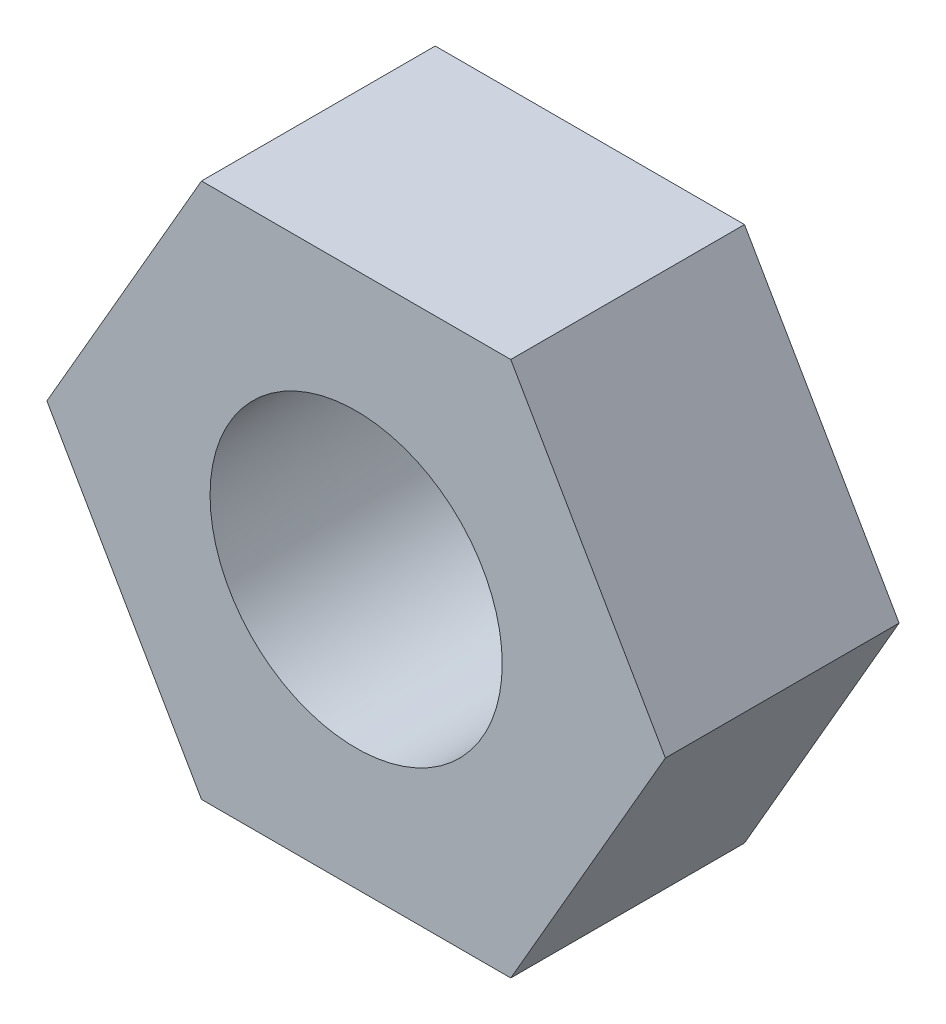
ISO-10303-21;
HEADER;
FILE_DESCRIPTION(('STEP AP214'),'2;1');
FILE_NAME('part.step','',(''),(''),'','','');
FILE_SCHEMA(('AUTOMOTIVE_DESIGN { 1 0 10303 214 1 1 1 1 }'));
ENDSEC;
DATA;
#1=APPLICATION_CONTEXT('core data for automotive mechanical design processes');
#2=APPLICATION_PROTOCOL_DEFINITION('international standard','automotive_design',2000,#1);
#3=PRODUCT_CONTEXT('',#1,'mechanical');
#4=PRODUCT('Part','Part','',(#3));
#5=PRODUCT_RELATED_PRODUCT_CATEGORY('part','',(#4));
#6=PRODUCT_DEFINITION_FORMATION('','',#4);
#7=PRODUCT_DEFINITION_CONTEXT('part definition',#1,'design');
#8=PRODUCT_DEFINITION('design','',#6,#7);
#9=PRODUCT_DEFINITION_SHAPE('','',#8);
#10=(LENGTH_UNIT() NAMED_UNIT(*) SI_UNIT(.MILLI.,.METRE.));
#11=(NAMED_UNIT(*) PLANE_ANGLE_UNIT() SI_UNIT($,.RADIAN.));
#12=(NAMED_UNIT(*) SI_UNIT($,.STERADIAN.) SOLID_ANGLE_UNIT());
#13=UNCERTAINTY_MEASURE_WITH_UNIT(LENGTH_MEASURE(1.E-05),#10,'distance_accuracy_value','');
#14=(GEOMETRIC_REPRESENTATION_CONTEXT(3) GLOBAL_UNCERTAINTY_ASSIGNED_CONTEXT((#13)) GLOBAL_UNIT_ASSIGNED_CONTEXT((#10,
#11,#12)) REPRESENTATION_CONTEXT('',''));
#15=CARTESIAN_POINT('',(0.,0.,0.));
#16=DIRECTION('',(0.,0.,1.));
#17=DIRECTION('',(1.,0.,0.));
#18=AXIS2_PLACEMENT_3D('',#15,#16,#17);
#19=CARTESIAN_POINT('',(0.,0.,2.4));
#20=DIRECTION('',(0.,0.,1.));
#21=DIRECTION('',(1.,0.,0.));
#22=AXIS2_PLACEMENT_3D('',#19,#20,#21);
#23=PLANE('',#22);
#24=DIRECTION('',(-1.,0.,0.));
#25=VECTOR('',#24,1.);
#26=CARTESIAN_POINT('',(1.58771324027148,2.75000000000002,2.4));
#27=LINE('',#26,#25);
#28=CARTESIAN_POINT('',(1.58771324027148,2.75000000000002,2.4));
#29=VERTEX_POINT('',#28);
#30=CARTESIAN_POINT('',(-1.58771324027148,2.75000000000002,2.4));
#31=VERTEX_POINT('',#30);
#32=EDGE_CURVE('E135',#29,#31,#27,.T.);
#33=ORIENTED_EDGE('',*,*,#32,.T.);
#34=DIRECTION('',(-0.5,-0.866025403784439,0.));
#35=VECTOR('',#34,1.);
#36=CARTESIAN_POINT('',(-1.58771324027148,2.75000000000002,2.4));
#37=LINE('',#36,#35);
#38=CARTESIAN_POINT('',(-3.17542648054297,0.,2.4));
#39=VERTEX_POINT('',#38);
#40=EDGE_CURVE('E93',#31,#39,#37,.T.);
#41=ORIENTED_EDGE('',*,*,#40,.T.);
#42=DIRECTION('',(0.5,-0.866025403784439,0.));
#43=VECTOR('',#42,1.);
#44=CARTESIAN_POINT('',(-3.17542648054297,0.,2.4));
#45=LINE('',#44,#43);
#46=CARTESIAN_POINT('',(-1.58771324027148,-2.75000000000002,2.4));
#47=VERTEX_POINT('',#46);
#48=EDGE_CURVE('E106',#39,#47,#45,.T.);
#49=ORIENTED_EDGE('',*,*,#48,.T.);
#50=DIRECTION('',(1.,0.,0.));
#51=VECTOR('',#50,1.);
#52=CARTESIAN_POINT('',(-1.58771324027148,-2.75000000000002,2.4));
#53=LINE('',#52,#51);
#54=CARTESIAN_POINT('',(1.58771324027148,-2.75000000000002,2.4));
#55=VERTEX_POINT('',#54);
#56=EDGE_CURVE('E100',#47,#55,#53,.T.);
#57=ORIENTED_EDGE('',*,*,#56,.T.);
#58=DIRECTION('',(0.5,0.866025403784439,0.));
#59=VECTOR('',#58,1.);
#60=CARTESIAN_POINT('',(1.58771324027148,-2.75000000000002,2.4));
#61=LINE('',#60,#59);
#62=CARTESIAN_POINT('',(3.17542648054297,0.,2.4));
#63=VERTEX_POINT('',#62);
#64=EDGE_CURVE('E104',#55,#63,#61,.T.);
#65=ORIENTED_EDGE('',*,*,#64,.T.);
#66=DIRECTION('',(-0.5,0.866025403784439,0.));
#67=VECTOR('',#66,1.);
#68=CARTESIAN_POINT('',(3.17542648054297,0.,2.4));
#69=LINE('',#68,#67);
#70=EDGE_CURVE('E56',#63,#29,#69,.T.);
#71=ORIENTED_EDGE('',*,*,#70,.T.);
#72=EDGE_LOOP('',(#33,#41,#49,#57,#65,#71));
#73=FACE_BOUND('',#72,.T.);
#74=CARTESIAN_POINT('',(0.,0.,2.4));
#75=DIRECTION('',(0.,0.,1.));
#76=DIRECTION('',(1.,0.,0.));
#77=AXIS2_PLACEMENT_3D('',#74,#75,#76);
#78=CIRCLE('',#77,1.5);
#79=CARTESIAN_POINT('',(1.5,0.,2.4));
#80=VERTEX_POINT('',#79);
#81=EDGE_CURVE('E128',#80,#80,#78,.T.);
#82=ORIENTED_EDGE('',*,*,#81,.F.);
#83=EDGE_LOOP('',(#82));
#84=FACE_BOUND('',#83,.T.);
#85=ADVANCED_FACE('F39',(#73,#84),#23,.T.);
#86=CARTESIAN_POINT('',(0.,0.,0.));
#87=DIRECTION('',(0.,0.,1.));
#88=DIRECTION('',(1.,0.,0.));
#89=AXIS2_PLACEMENT_3D('',#86,#87,#88);
#90=PLANE('',#89);
#91=DIRECTION('',(-1.,0.,0.));
#92=VECTOR('',#91,1.);
#93=CARTESIAN_POINT('',(1.58771324027148,2.75000000000002,0.));
#94=LINE('',#93,#92);
#95=CARTESIAN_POINT('',(1.58771324027148,2.75000000000002,0.));
#96=VERTEX_POINT('',#95);
#97=CARTESIAN_POINT('',(-1.58771324027148,2.75000000000002,0.));
#98=VERTEX_POINT('',#97);
#99=EDGE_CURVE('E124',#96,#98,#94,.T.);
#100=ORIENTED_EDGE('',*,*,#99,.F.);
#101=DIRECTION('',(-0.5,0.866025403784439,0.));
#102=VECTOR('',#101,1.);
#103=CARTESIAN_POINT('',(3.17542648054297,0.,0.));
#104=LINE('',#103,#102);
#105=CARTESIAN_POINT('',(3.17542648054297,0.,0.));
#106=VERTEX_POINT('',#105);
#107=EDGE_CURVE('E85',#106,#96,#104,.T.);
#108=ORIENTED_EDGE('',*,*,#107,.F.);
#109=DIRECTION('',(0.5,0.866025403784439,0.));
#110=VECTOR('',#109,1.);
#111=CARTESIAN_POINT('',(1.58771324027148,-2.75000000000002,0.));
#112=LINE('',#111,#110);
#113=CARTESIAN_POINT('',(1.58771324027148,-2.75000000000002,0.));
#114=VERTEX_POINT('',#113);
#115=EDGE_CURVE('E79',#114,#106,#112,.T.);
#116=ORIENTED_EDGE('',*,*,#115,.F.);
#117=DIRECTION('',(1.,0.,0.));
#118=VECTOR('',#117,1.);
#119=CARTESIAN_POINT('',(-1.58771324027148,-2.75000000000002,0.));
#120=LINE('',#119,#118);
#121=CARTESIAN_POINT('',(-1.58771324027148,-2.75000000000002,0.));
#122=VERTEX_POINT('',#121);
#123=EDGE_CURVE('E114',#122,#114,#120,.T.);
#124=ORIENTED_EDGE('',*,*,#123,.F.);
#125=DIRECTION('',(0.5,-0.866025403784439,0.));
#126=VECTOR('',#125,1.);
#127=CARTESIAN_POINT('',(-3.17542648054297,0.,0.));
#128=LINE('',#127,#126);
#129=CARTESIAN_POINT('',(-3.17542648054297,0.,0.));
#130=VERTEX_POINT('',#129);
#131=EDGE_CURVE('E130',#130,#122,#128,.T.);
#132=ORIENTED_EDGE('',*,*,#131,.F.);
#133=DIRECTION('',(-0.5,-0.866025403784439,0.));
#134=VECTOR('',#133,1.);
#135=CARTESIAN_POINT('',(-1.58771324027148,2.75000000000002,0.));
#136=LINE('',#135,#134);
#137=EDGE_CURVE('E127',#98,#130,#136,.T.);
#138=ORIENTED_EDGE('',*,*,#137,.F.);
#139=EDGE_LOOP('',(#100,#108,#116,#124,#132,#138));
#140=FACE_BOUND('',#139,.T.);
#141=CARTESIAN_POINT('',(0.,0.,0.));
#142=DIRECTION('',(0.,0.,1.));
#143=DIRECTION('',(1.,0.,0.));
#144=AXIS2_PLACEMENT_3D('',#141,#142,#143);
#145=CIRCLE('',#144,1.5);
#146=CARTESIAN_POINT('',(1.5,0.,0.));
#147=VERTEX_POINT('',#146);
#148=EDGE_CURVE('E246',#147,#147,#145,.T.);
#149=ORIENTED_EDGE('',*,*,#148,.T.);
#150=EDGE_LOOP('',(#149));
#151=FACE_BOUND('',#150,.T.);
#152=ADVANCED_FACE('F144',(#140,#151),#90,.F.);
#153=CARTESIAN_POINT('',(1.58771324027148,2.75000000000002,2.4));
#154=DIRECTION('',(0.,-1.,0.));
#155=DIRECTION('',(1.,0.,0.));
#156=AXIS2_PLACEMENT_3D('',#153,#154,#155);
#157=PLANE('',#156);
#158=ORIENTED_EDGE('',*,*,#99,.T.);
#159=DIRECTION('',(0.,0.,-1.));
#160=VECTOR('',#159,1.);
#161=CARTESIAN_POINT('',(-1.58771324027148,2.75000000000002,2.4));
#162=LINE('',#161,#160);
#163=EDGE_CURVE('E11',#31,#98,#162,.T.);
#164=ORIENTED_EDGE('',*,*,#163,.F.);
#165=ORIENTED_EDGE('',*,*,#32,.F.);
#166=DIRECTION('',(0.,0.,-1.));
#167=VECTOR('',#166,1.);
#168=CARTESIAN_POINT('',(1.58771324027148,2.75000000000002,2.4));
#169=LINE('',#168,#167);
#170=EDGE_CURVE('E120',#29,#96,#169,.T.);
#171=ORIENTED_EDGE('',*,*,#170,.T.);
#172=EDGE_LOOP('',(#158,#164,#165,#171));
#173=FACE_BOUND('',#172,.T.);
#174=ADVANCED_FACE('F41',(#173),#157,.F.);
#175=CARTESIAN_POINT('',(-1.58771324027148,2.75000000000002,2.4));
#176=DIRECTION('',(0.866025403784439,-0.5,0.));
#177=DIRECTION('',(0.5,0.866025403784439,0.));
#178=AXIS2_PLACEMENT_3D('',#175,#176,#177);
#179=PLANE('',#178);
#180=ORIENTED_EDGE('',*,*,#137,.T.);
#181=DIRECTION('',(0.,0.,-1.));
#182=VECTOR('',#181,1.);
#183=CARTESIAN_POINT('',(-3.17542648054297,0.,2.4));
#184=LINE('',#183,#182);
#185=EDGE_CURVE('E48',#39,#130,#184,.T.);
#186=ORIENTED_EDGE('',*,*,#185,.F.);
#187=ORIENTED_EDGE('',*,*,#40,.F.);
#188=ORIENTED_EDGE('',*,*,#163,.T.);
#189=EDGE_LOOP('',(#180,#186,#187,#188));
#190=FACE_BOUND('',#189,.T.);
#191=ADVANCED_FACE('F169',(#190),#179,.F.);
#192=CARTESIAN_POINT('',(-3.17542648054297,0.,2.4));
#193=DIRECTION('',(0.866025403784439,0.5,0.));
#194=DIRECTION('',(-0.5,0.866025403784439,0.));
#195=AXIS2_PLACEMENT_3D('',#192,#193,#194);
#196=PLANE('',#195);
#197=ORIENTED_EDGE('',*,*,#131,.T.);
#198=DIRECTION('',(0.,0.,-1.));
#199=VECTOR('',#198,1.);
#200=CARTESIAN_POINT('',(-1.58771324027148,-2.75000000000002,2.4));
#201=LINE('',#200,#199);
#202=EDGE_CURVE('E115',#47,#122,#201,.T.);
#203=ORIENTED_EDGE('',*,*,#202,.F.);
#204=ORIENTED_EDGE('',*,*,#48,.F.);
#205=ORIENTED_EDGE('',*,*,#185,.T.);
#206=EDGE_LOOP('',(#197,#203,#204,#205));
#207=FACE_BOUND('',#206,.T.);
#208=ADVANCED_FACE('F141',(#207),#196,.F.);
#209=CARTESIAN_POINT('',(-1.58771324027148,-2.75000000000002,2.4));
#210=DIRECTION('',(0.,1.,0.));
#211=DIRECTION('',(-1.,0.,0.));
#212=AXIS2_PLACEMENT_3D('',#209,#210,#211);
#213=PLANE('',#212);
#214=ORIENTED_EDGE('',*,*,#123,.T.);
#215=DIRECTION('',(0.,0.,-1.));
#216=VECTOR('',#215,1.);
#217=CARTESIAN_POINT('',(1.58771324027148,-2.75000000000002,2.4));
#218=LINE('',#217,#216);
#219=EDGE_CURVE('E111',#55,#114,#218,.T.);
#220=ORIENTED_EDGE('',*,*,#219,.F.);
#221=ORIENTED_EDGE('',*,*,#56,.F.);
#222=ORIENTED_EDGE('',*,*,#202,.T.);
#223=EDGE_LOOP('',(#214,#220,#221,#222));
#224=FACE_BOUND('',#223,.T.);
#225=ADVANCED_FACE('F112',(#224),#213,.F.);
#226=CARTESIAN_POINT('',(1.58771324027148,-2.75000000000002,2.4));
#227=DIRECTION('',(-0.866025403784439,0.5,0.));
#228=DIRECTION('',(-0.5,-0.866025403784439,0.));
#229=AXIS2_PLACEMENT_3D('',#226,#227,#228);
#230=PLANE('',#229);
#231=ORIENTED_EDGE('',*,*,#115,.T.);
#232=DIRECTION('',(0.,0.,-1.));
#233=VECTOR('',#232,1.);
#234=CARTESIAN_POINT('',(3.17542648054297,0.,2.4));
#235=LINE('',#234,#233);
#236=EDGE_CURVE('E116',#63,#106,#235,.T.);
#237=ORIENTED_EDGE('',*,*,#236,.F.);
#238=ORIENTED_EDGE('',*,*,#64,.F.);
#239=ORIENTED_EDGE('',*,*,#219,.T.);
#240=EDGE_LOOP('',(#231,#237,#238,#239));
#241=FACE_BOUND('',#240,.T.);
#242=ADVANCED_FACE('F118',(#241),#230,.F.);
#243=CARTESIAN_POINT('',(3.17542648054297,0.,2.4));
#244=DIRECTION('',(-0.866025403784439,-0.5,0.));
#245=DIRECTION('',(0.5,-0.866025403784439,0.));
#246=AXIS2_PLACEMENT_3D('',#243,#244,#245);
#247=PLANE('',#246);
#248=ORIENTED_EDGE('',*,*,#107,.T.);
#249=ORIENTED_EDGE('',*,*,#170,.F.);
#250=ORIENTED_EDGE('',*,*,#70,.F.);
#251=ORIENTED_EDGE('',*,*,#236,.T.);
#252=EDGE_LOOP('',(#248,#249,#250,#251));
#253=FACE_BOUND('',#252,.T.);
#254=ADVANCED_FACE('F149',(#253),#247,.F.);
#255=CARTESIAN_POINT('',(0.,0.,2.4));
#256=DIRECTION('',(0.,0.,-1.));
#257=DIRECTION('',(-1.,0.,0.));
#258=AXIS2_PLACEMENT_3D('',#255,#256,#257);
#259=CYLINDRICAL_SURFACE('',#258,1.5);
#260=ORIENTED_EDGE('',*,*,#81,.T.);
#261=EDGE_LOOP('',(#260));
#262=FACE_BOUND('',#261,.T.);
#263=ORIENTED_EDGE('',*,*,#148,.F.);
#264=EDGE_LOOP('',(#263));
#265=FACE_BOUND('',#264,.T.);
#266=ADVANCED_FACE('F151',(#262,#265),#259,.F.);
#267=CLOSED_SHELL('',(#85,#152,#174,#191,#208,#225,#242,#254,#266));
#268=MANIFOLD_SOLID_BREP('B2',#267);
#269=ADVANCED_BREP_SHAPE_REPRESENTATION('',(#18,#268),#14);
#270=SHAPE_DEFINITION_REPRESENTATION(#9,#269);
ENDSEC;
END-ISO-10303-21;
